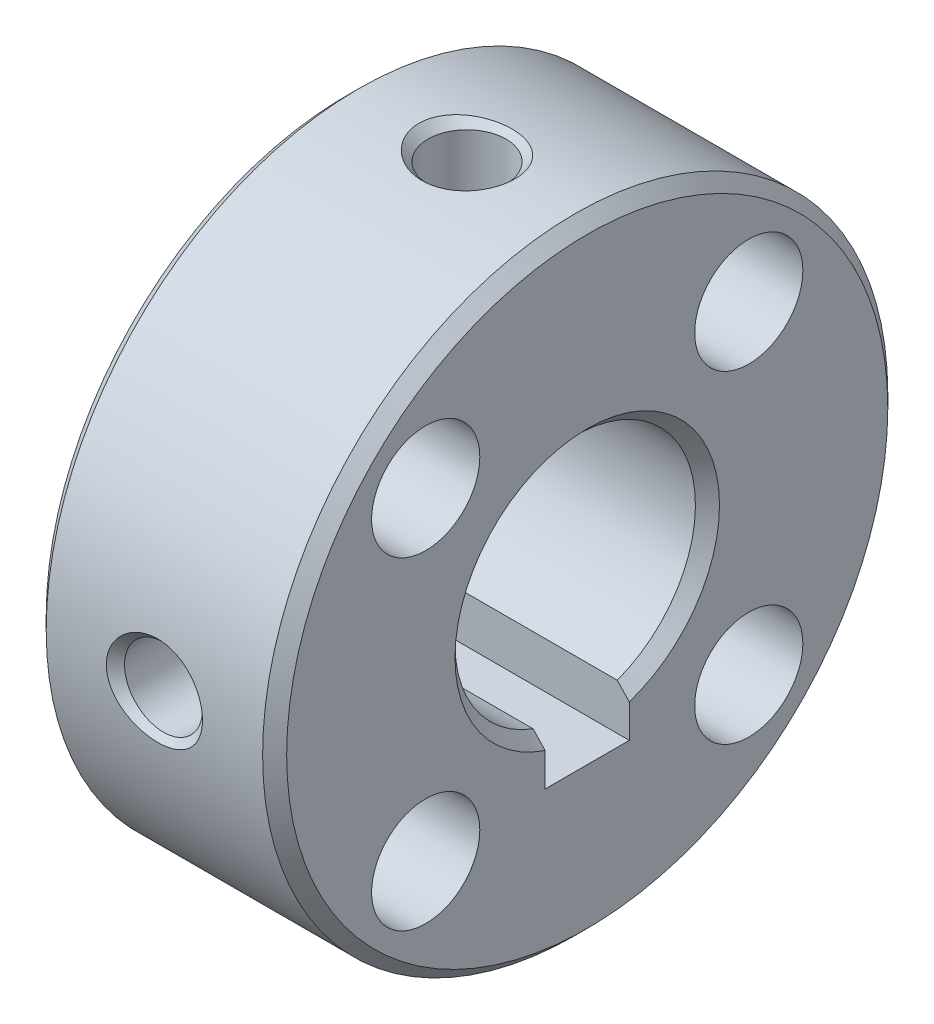
ISO-10303-21;
HEADER;
FILE_DESCRIPTION(('STEP AP214'),'2;1');
FILE_NAME('part.step','',(''),(''),'','','');
FILE_SCHEMA(('AUTOMOTIVE_DESIGN { 1 0 10303 214 1 1 1 1 }'));
ENDSEC;
DATA;
#1=APPLICATION_CONTEXT('core data for automotive mechanical design processes');
#2=APPLICATION_PROTOCOL_DEFINITION('international standard','automotive_design',2000,#1);
#3=PRODUCT_CONTEXT('',#1,'mechanical');
#4=PRODUCT('Part','Part','',(#3));
#5=PRODUCT_RELATED_PRODUCT_CATEGORY('part','',(#4));
#6=PRODUCT_DEFINITION_FORMATION('','',#4);
#7=PRODUCT_DEFINITION_CONTEXT('part definition',#1,'design');
#8=PRODUCT_DEFINITION('design','',#6,#7);
#9=PRODUCT_DEFINITION_SHAPE('','',#8);
#10=(LENGTH_UNIT() NAMED_UNIT(*) SI_UNIT(.MILLI.,.METRE.));
#11=(NAMED_UNIT(*) PLANE_ANGLE_UNIT() SI_UNIT($,.RADIAN.));
#12=(NAMED_UNIT(*) SI_UNIT($,.STERADIAN.) SOLID_ANGLE_UNIT());
#13=UNCERTAINTY_MEASURE_WITH_UNIT(LENGTH_MEASURE(1.E-05),#10,'distance_accuracy_value','');
#14=(GEOMETRIC_REPRESENTATION_CONTEXT(3) GLOBAL_UNCERTAINTY_ASSIGNED_CONTEXT((#13)) GLOBAL_UNIT_ASSIGNED_CONTEXT((#10,
#11,#12)) REPRESENTATION_CONTEXT('',''));
#15=CARTESIAN_POINT('',(0.,0.,0.));
#16=DIRECTION('',(0.,0.,1.));
#17=DIRECTION('',(1.,0.,0.));
#18=AXIS2_PLACEMENT_3D('',#15,#16,#17);
#19=CARTESIAN_POINT('',(10.,-6.7175144212722,-6.7175144212722));
#20=DIRECTION('',(-1.,0.,0.));
#21=DIRECTION('',(0.,0.,1.));
#22=AXIS2_PLACEMENT_3D('',#19,#20,#21);
#23=CYLINDRICAL_SURFACE('',#22,2.25);
#24=CARTESIAN_POINT('',(0.,-6.7175144212722,-6.7175144212722));
#25=DIRECTION('',(1.,0.,0.));
#26=DIRECTION('',(0.,0.,-1.));
#27=AXIS2_PLACEMENT_3D('',#24,#25,#26);
#28=CIRCLE('',#27,2.25);
#29=CARTESIAN_POINT('',(0.,-6.7175144212722,-8.9675144212722));
#30=VERTEX_POINT('',#29);
#31=EDGE_CURVE('E132',#30,#30,#28,.T.);
#32=ORIENTED_EDGE('',*,*,#31,.F.);
#33=EDGE_LOOP('',(#32));
#34=FACE_BOUND('',#33,.T.);
#35=CARTESIAN_POINT('',(10.,-6.7175144212722,-6.7175144212722));
#36=DIRECTION('',(1.,0.,0.));
#37=DIRECTION('',(0.,0.,-1.));
#38=AXIS2_PLACEMENT_3D('',#35,#36,#37);
#39=CIRCLE('',#38,2.25);
#40=CARTESIAN_POINT('',(10.,-6.7175144212722,-8.9675144212722));
#41=VERTEX_POINT('',#40);
#42=EDGE_CURVE('E123',#41,#41,#39,.T.);
#43=ORIENTED_EDGE('',*,*,#42,.T.);
#44=EDGE_LOOP('',(#43));
#45=FACE_BOUND('',#44,.T.);
#46=ADVANCED_FACE('F16',(#34,#45),#23,.F.);
#47=CARTESIAN_POINT('',(10.,-6.7175144212722,6.7175144212722));
#48=DIRECTION('',(-1.,0.,0.));
#49=DIRECTION('',(0.,0.,1.));
#50=AXIS2_PLACEMENT_3D('',#47,#48,#49);
#51=CYLINDRICAL_SURFACE('',#50,2.25);
#52=CARTESIAN_POINT('',(0.,-6.7175144212722,6.7175144212722));
#53=DIRECTION('',(1.,0.,0.));
#54=DIRECTION('',(0.,0.,-1.));
#55=AXIS2_PLACEMENT_3D('',#52,#53,#54);
#56=CIRCLE('',#55,2.25);
#57=CARTESIAN_POINT('',(0.,-6.7175144212722,4.4675144212722));
#58=VERTEX_POINT('',#57);
#59=EDGE_CURVE('E135',#58,#58,#56,.T.);
#60=ORIENTED_EDGE('',*,*,#59,.F.);
#61=EDGE_LOOP('',(#60));
#62=FACE_BOUND('',#61,.T.);
#63=CARTESIAN_POINT('',(10.,-6.7175144212722,6.7175144212722));
#64=DIRECTION('',(1.,0.,0.));
#65=DIRECTION('',(0.,0.,-1.));
#66=AXIS2_PLACEMENT_3D('',#63,#64,#65);
#67=CIRCLE('',#66,2.25);
#68=CARTESIAN_POINT('',(10.,-6.7175144212722,4.4675144212722));
#69=VERTEX_POINT('',#68);
#70=EDGE_CURVE('E177',#69,#69,#67,.T.);
#71=ORIENTED_EDGE('',*,*,#70,.T.);
#72=EDGE_LOOP('',(#71));
#73=FACE_BOUND('',#72,.T.);
#74=ADVANCED_FACE('F260',(#62,#73),#51,.F.);
#75=CARTESIAN_POINT('',(10.,6.7175144212722,6.7175144212722));
#76=DIRECTION('',(-1.,0.,0.));
#77=DIRECTION('',(0.,0.,1.));
#78=AXIS2_PLACEMENT_3D('',#75,#76,#77);
#79=CYLINDRICAL_SURFACE('',#78,2.25);
#80=CARTESIAN_POINT('',(0.,6.7175144212722,6.7175144212722));
#81=DIRECTION('',(1.,0.,0.));
#82=DIRECTION('',(0.,0.,-1.));
#83=AXIS2_PLACEMENT_3D('',#80,#81,#82);
#84=CIRCLE('',#83,2.25);
#85=CARTESIAN_POINT('',(0.,6.7175144212722,4.4675144212722));
#86=VERTEX_POINT('',#85);
#87=EDGE_CURVE('E157',#86,#86,#84,.T.);
#88=ORIENTED_EDGE('',*,*,#87,.F.);
#89=EDGE_LOOP('',(#88));
#90=FACE_BOUND('',#89,.T.);
#91=CARTESIAN_POINT('',(10.,6.7175144212722,6.7175144212722));
#92=DIRECTION('',(1.,0.,0.));
#93=DIRECTION('',(0.,0.,-1.));
#94=AXIS2_PLACEMENT_3D('',#91,#92,#93);
#95=CIRCLE('',#94,2.25);
#96=CARTESIAN_POINT('',(10.,6.7175144212722,4.4675144212722));
#97=VERTEX_POINT('',#96);
#98=EDGE_CURVE('E181',#97,#97,#95,.T.);
#99=ORIENTED_EDGE('',*,*,#98,.T.);
#100=EDGE_LOOP('',(#99));
#101=FACE_BOUND('',#100,.T.);
#102=ADVANCED_FACE('F256',(#90,#101),#79,.F.);
#103=CARTESIAN_POINT('',(10.,6.7175144212722,-6.7175144212722));
#104=DIRECTION('',(-1.,0.,0.));
#105=DIRECTION('',(0.,0.,1.));
#106=AXIS2_PLACEMENT_3D('',#103,#104,#105);
#107=CYLINDRICAL_SURFACE('',#106,2.25);
#108=CARTESIAN_POINT('',(0.,6.7175144212722,-6.7175144212722));
#109=DIRECTION('',(1.,0.,0.));
#110=DIRECTION('',(0.,0.,-1.));
#111=AXIS2_PLACEMENT_3D('',#108,#109,#110);
#112=CIRCLE('',#111,2.25);
#113=CARTESIAN_POINT('',(0.,6.7175144212722,-8.9675144212722));
#114=VERTEX_POINT('',#113);
#115=EDGE_CURVE('E161',#114,#114,#112,.T.);
#116=ORIENTED_EDGE('',*,*,#115,.F.);
#117=EDGE_LOOP('',(#116));
#118=FACE_BOUND('',#117,.T.);
#119=CARTESIAN_POINT('',(10.,6.7175144212722,-6.7175144212722));
#120=DIRECTION('',(1.,0.,0.));
#121=DIRECTION('',(0.,0.,-1.));
#122=AXIS2_PLACEMENT_3D('',#119,#120,#121);
#123=CIRCLE('',#122,2.25);
#124=CARTESIAN_POINT('',(10.,6.7175144212722,-8.9675144212722));
#125=VERTEX_POINT('',#124);
#126=EDGE_CURVE('E185',#125,#125,#123,.T.);
#127=ORIENTED_EDGE('',*,*,#126,.T.);
#128=EDGE_LOOP('',(#127));
#129=FACE_BOUND('',#128,.T.);
#130=ADVANCED_FACE('F259',(#118,#129),#107,.F.);
#131=CARTESIAN_POINT('',(10.,-6.6,-1.75));
#132=DIRECTION('',(0.,0.,1.));
#133=DIRECTION('',(0.,-1.,0.));
#134=AXIS2_PLACEMENT_3D('',#131,#132,#133);
#135=PLANE('',#134);
#136=DIRECTION('',(0.,1.,0.));
#137=VECTOR('',#136,1.);
#138=CARTESIAN_POINT('',(0.,-6.6,-1.75));
#139=LINE('',#138,#137);
#140=CARTESIAN_POINT('',(0.,-6.6,-1.75));
#141=VERTEX_POINT('',#140);
#142=CARTESIAN_POINT('',(0.,-5.21416340365355,-1.75));
#143=VERTEX_POINT('',#142);
#144=EDGE_CURVE('E138',#141,#143,#139,.T.);
#145=ORIENTED_EDGE('',*,*,#144,.F.);
#146=DIRECTION('',(-1.,0.,0.));
#147=VECTOR('',#146,1.);
#148=CARTESIAN_POINT('',(10.,-6.6,-1.75));
#149=LINE('',#148,#147);
#150=CARTESIAN_POINT('',(10.,-6.6,-1.75));
#151=VERTEX_POINT('',#150);
#152=EDGE_CURVE('E10',#151,#141,#149,.T.);
#153=ORIENTED_EDGE('',*,*,#152,.F.);
#154=DIRECTION('',(0.,1.,0.));
#155=VECTOR('',#154,1.);
#156=CARTESIAN_POINT('',(10.,-6.6,-1.75));
#157=LINE('',#156,#155);
#158=CARTESIAN_POINT('',(10.,-5.21416340365355,-1.75));
#159=VERTEX_POINT('',#158);
#160=EDGE_CURVE('E130',#151,#159,#157,.T.);
#161=ORIENTED_EDGE('',*,*,#160,.T.);
#162=CARTESIAN_POINT('',(9.5,-4.6837484987988,-1.75));
#163=CARTESIAN_POINT('',(9.6660933263045,-4.86105661680204,-1.75));
#164=CARTESIAN_POINT('',(9.83281493123391,-5.03781337258833,-1.75));
#165=CARTESIAN_POINT('',(10.,-5.21416340365356,-1.75));
#166=B_SPLINE_CURVE_WITH_KNOTS('',3,(#162,#163,#164,#165),.UNSPECIFIED.,.F.,.F.,(4,4),
(0.00580846189595319,0.00653929703107849),.UNSPECIFIED.);
#167=CARTESIAN_POINT('',(9.5,-4.6837484987988,-1.75));
#168=VERTEX_POINT('',#167);
#169=EDGE_CURVE('E112',#168,#159,#166,.T.);
#170=ORIENTED_EDGE('',*,*,#169,.F.);
#171=DIRECTION('',(1.,0.,0.));
#172=VECTOR('',#171,1.);
#173=CARTESIAN_POINT('',(10.,-4.6837484987988,-1.75));
#174=LINE('',#173,#172);
#175=CARTESIAN_POINT('',(0.5,-4.6837484987988,-1.75));
#176=VERTEX_POINT('',#175);
#177=EDGE_CURVE('E104',#176,#168,#174,.T.);
#178=ORIENTED_EDGE('',*,*,#177,.F.);
#179=CARTESIAN_POINT('',(0.,-5.21416340365355,-1.75));
#180=CARTESIAN_POINT('',(0.167175380453636,-5.03782359200693,-1.75));
#181=CARTESIAN_POINT('',(0.333896027324393,-4.86106798202704,-1.75));
#182=CARTESIAN_POINT('',(0.5,-4.6837484987988,-1.75));
#183=B_SPLINE_CURVE_WITH_KNOTS('',3,(#179,#180,#181,#182),.UNSPECIFIED.,.F.,.F.,(4,4),
(1.01727636145913E-06,0.0007298639149139),.UNSPECIFIED.);
#184=EDGE_CURVE('E19',#143,#176,#183,.T.);
#185=ORIENTED_EDGE('',*,*,#184,.F.);
#186=EDGE_LOOP('',(#145,#153,#161,#170,#178,#185));
#187=FACE_BOUND('',#186,.T.);
#188=ADVANCED_FACE('F110',(#187),#135,.T.);
#189=CARTESIAN_POINT('',(10.,-6.6,1.75));
#190=DIRECTION('',(0.,1.,0.));
#191=DIRECTION('',(1.,0.,0.));
#192=AXIS2_PLACEMENT_3D('',#189,#190,#191);
#193=PLANE('',#192);
#194=DIRECTION('',(0.,0.,-1.));
#195=VECTOR('',#194,1.);
#196=CARTESIAN_POINT('',(0.,-6.6,1.75));
#197=LINE('',#196,#195);
#198=CARTESIAN_POINT('',(0.,-6.6,1.75));
#199=VERTEX_POINT('',#198);
#200=EDGE_CURVE('E136',#199,#141,#197,.T.);
#201=ORIENTED_EDGE('',*,*,#200,.F.);
#202=DIRECTION('',(-1.,0.,0.));
#203=VECTOR('',#202,1.);
#204=CARTESIAN_POINT('',(10.,-6.6,1.75));
#205=LINE('',#204,#203);
#206=CARTESIAN_POINT('',(10.,-6.6,1.75));
#207=VERTEX_POINT('',#206);
#208=EDGE_CURVE('E27',#207,#199,#205,.T.);
#209=ORIENTED_EDGE('',*,*,#208,.F.);
#210=DIRECTION('',(0.,0.,-1.));
#211=VECTOR('',#210,1.);
#212=CARTESIAN_POINT('',(10.,-6.6,1.75));
#213=LINE('',#212,#211);
#214=EDGE_CURVE('E131',#207,#151,#213,.T.);
#215=ORIENTED_EDGE('',*,*,#214,.T.);
#216=ORIENTED_EDGE('',*,*,#152,.T.);
#217=EDGE_LOOP('',(#201,#209,#215,#216));
#218=FACE_BOUND('',#217,.T.);
#219=ADVANCED_FACE('F270',(#218),#193,.T.);
#220=CARTESIAN_POINT('',(10.,0.,1.75));
#221=DIRECTION('',(0.,0.,-1.));
#222=DIRECTION('',(0.,-1.,0.));
#223=AXIS2_PLACEMENT_3D('',#220,#221,#222);
#224=PLANE('',#223);
#225=DIRECTION('',(-1.,0.,0.));
#226=VECTOR('',#225,1.);
#227=CARTESIAN_POINT('',(10.,-4.6837484987988,1.75));
#228=LINE('',#227,#226);
#229=CARTESIAN_POINT('',(9.5,-4.6837484987988,1.75));
#230=VERTEX_POINT('',#229);
#231=CARTESIAN_POINT('',(0.5,-4.6837484987988,1.75));
#232=VERTEX_POINT('',#231);
#233=EDGE_CURVE('E106',#230,#232,#228,.T.);
#234=ORIENTED_EDGE('',*,*,#233,.F.);
#235=CARTESIAN_POINT('',(10.,-5.21416340365355,1.75));
#236=CARTESIAN_POINT('',(9.83282461954636,-5.03782359200693,1.75));
#237=CARTESIAN_POINT('',(9.66610397267561,-4.86106798202704,1.75));
#238=CARTESIAN_POINT('',(9.5,-4.6837484987988,1.75));
#239=B_SPLINE_CURVE_WITH_KNOTS('',3,(#235,#236,#237,#238),.UNSPECIFIED.,.F.,.F.,(4,4),
(1.01727636146181E-06,0.000729863914913902),.UNSPECIFIED.);
#240=CARTESIAN_POINT('',(10.,-5.21416340365355,1.75));
#241=VERTEX_POINT('',#240);
#242=EDGE_CURVE('E172',#241,#230,#239,.T.);
#243=ORIENTED_EDGE('',*,*,#242,.F.);
#244=DIRECTION('',(0.,-1.,0.));
#245=VECTOR('',#244,1.);
#246=CARTESIAN_POINT('',(10.,0.,1.75));
#247=LINE('',#246,#245);
#248=EDGE_CURVE('E127',#241,#207,#247,.T.);
#249=ORIENTED_EDGE('',*,*,#248,.T.);
#250=ORIENTED_EDGE('',*,*,#208,.T.);
#251=DIRECTION('',(0.,-1.,0.));
#252=VECTOR('',#251,1.);
#253=CARTESIAN_POINT('',(0.,0.,1.75));
#254=LINE('',#253,#252);
#255=CARTESIAN_POINT('',(0.,-5.21416340365355,1.75));
#256=VERTEX_POINT('',#255);
#257=EDGE_CURVE('E144',#256,#199,#254,.T.);
#258=ORIENTED_EDGE('',*,*,#257,.F.);
#259=CARTESIAN_POINT('',(0.5,-4.6837484987988,1.75));
#260=CARTESIAN_POINT('',(0.333906673695495,-4.86105661680204,1.75));
#261=CARTESIAN_POINT('',(0.167185068766092,-5.03781337258833,1.75));
#262=CARTESIAN_POINT('',(0.,-5.21416340365356,1.75));
#263=B_SPLINE_CURVE_WITH_KNOTS('',3,(#259,#260,#261,#262),.UNSPECIFIED.,.F.,.F.,(4,4),
(0.00580846189595319,0.00653929703107849),.UNSPECIFIED.);
#264=EDGE_CURVE('E98',#232,#256,#263,.T.);
#265=ORIENTED_EDGE('',*,*,#264,.F.);
#266=EDGE_LOOP('',(#234,#243,#249,#250,#258,#265));
#267=FACE_BOUND('',#266,.T.);
#268=ADVANCED_FACE('F490',(#267),#224,.T.);
#269=CARTESIAN_POINT('',(5.,0.,2.5));
#270=DIRECTION('',(0.,0.,-1.));
#271=DIRECTION('',(0.,1.,0.));
#272=AXIS2_PLACEMENT_3D('',#269,#270,#271);
#273=CYLINDRICAL_SURFACE('',#272,1.621);
#274=CARTESIAN_POINT('',(5.,0.,12.621));
#275=DIRECTION('',(0.,0.,-1.));
#276=DIRECTION('',(0.,1.,0.));
#277=AXIS2_PLACEMENT_3D('',#274,#275,#276);
#278=CIRCLE('',#277,1.621);
#279=CARTESIAN_POINT('',(5.,1.621,12.621));
#280=VERTEX_POINT('',#279);
#281=EDGE_CURVE('E147',#280,#280,#278,.T.);
#282=ORIENTED_EDGE('',*,*,#281,.F.);
#283=EDGE_LOOP('',(#282));
#284=FACE_BOUND('',#283,.T.);
#285=CARTESIAN_POINT('',(5.,1.621,4.7299428114936));
#286=CARTESIAN_POINT('',(4.91155533903857,1.62099994328776,4.72994292406814));
#287=CARTESIAN_POINT('',(4.82310933967548,1.61373692937462,4.73245066423388));
#288=CARTESIAN_POINT('',(4.64882792226246,1.58496808142389,4.74216205880075));
#289=CARTESIAN_POINT('',(4.56299305821168,1.56345924662211,4.7493667025607));
#290=CARTESIAN_POINT('',(4.39648524387535,1.50702583103183,4.76757195551883));
#291=CARTESIAN_POINT('',(4.31580294721599,1.4721263954811,4.77856544600252));
#292=CARTESIAN_POINT('',(4.16141399635067,1.38998746751381,4.8030995572268));
#293=CARTESIAN_POINT('',(4.08770875224652,1.34274548782248,4.8166406912155));
#294=CARTESIAN_POINT('',(3.9466396110385,1.23539069267372,4.8453061470038));
#295=CARTESIAN_POINT('',(3.87957160452023,1.17489908548066,4.86046835330996));
#296=CARTESIAN_POINT('',(3.75633191937484,1.04357152557501,4.89034638937721));
#297=CARTESIAN_POINT('',(3.70016188610794,0.972734013678075,4.90506215145229));
#298=CARTESIAN_POINT('',(3.59898652032845,0.820578393714075,4.93282551035559));
#299=CARTESIAN_POINT('',(3.55428885000518,0.739045824357353,4.94582333344247));
#300=CARTESIAN_POINT('',(3.47935822189785,0.569126300769084,4.96824171071121));
#301=CARTESIAN_POINT('',(3.44912158919692,0.480741094608509,4.97766317361134));
#302=CARTESIAN_POINT('',(3.40496784875951,0.302725713616444,4.99159902928383));
#303=CARTESIAN_POINT('',(3.39054437205525,0.213233246305292,4.99626532047137));
#304=CARTESIAN_POINT('',(3.37681883640726,0.0329849011828254,5.00070305137215));
#305=CARTESIAN_POINT('',(3.37751308553128,-0.0577706627545897,5.00047568617588));
#306=CARTESIAN_POINT('',(3.39367679157553,-0.234393884666983,4.9952559207467));
#307=CARTESIAN_POINT('',(3.40859673428687,-0.320317917411438,4.99044074476224));
#308=CARTESIAN_POINT('',(3.45188273226516,-0.488369179265733,4.97680687838058));
#309=CARTESIAN_POINT('',(3.48024968497549,-0.570496154561233,4.96798792077566));
#310=CARTESIAN_POINT('',(3.5499595290533,-0.729853012220349,4.94710629162889));
#311=CARTESIAN_POINT('',(3.5914633894381,-0.807007027582676,4.93500366256205));
#312=CARTESIAN_POINT('',(3.68613786401976,-0.953421632492302,4.90882135304546));
#313=CARTESIAN_POINT('',(3.73931159544957,-1.02268010547286,4.89474114471111));
#314=CARTESIAN_POINT('',(3.85860898566963,-1.15461028599396,4.86535187074547));
#315=CARTESIAN_POINT('',(3.92520511550441,-1.21684940617501,4.85001600819242));
#316=CARTESIAN_POINT('',(4.06802613798782,-1.32941122429761,4.8203798887855));
#317=CARTESIAN_POINT('',(4.14425235022557,-1.37973228641201,4.80607977428124));
#318=CARTESIAN_POINT('',(4.30547399049183,-1.46758519790192,4.77999260788244));
#319=CARTESIAN_POINT('',(4.39056945026866,-1.50494453323711,4.76824018219582));
#320=CARTESIAN_POINT('',(4.56631866058027,-1.56466156409866,4.74898201916711));
#321=CARTESIAN_POINT('',(4.65697021619478,-1.58702514249676,4.74147461667353));
#322=CARTESIAN_POINT('',(4.83708817443766,-1.61525576019124,4.73193012064711));
#323=CARTESIAN_POINT('',(4.92643835540342,-1.621789848282,4.7296720002319));
#324=CARTESIAN_POINT('',(5.10496876986582,-1.62005801882603,4.73026575887034));
#325=CARTESIAN_POINT('',(5.19414902957036,-1.6117946063918,4.73311677298359));
#326=CARTESIAN_POINT('',(5.36684695694947,-1.58130032679845,4.74338815178071));
#327=CARTESIAN_POINT('',(5.450454511033,-1.55952317660208,4.75065993614618));
#328=CARTESIAN_POINT('',(5.61281554339188,-1.50315878411261,4.76879273797322));
#329=CARTESIAN_POINT('',(5.69156818840378,-1.46856934990712,4.77965436954789));
#330=CARTESIAN_POINT('',(5.84463470079953,-1.38636523898081,4.80415227041365));
#331=CARTESIAN_POINT('',(5.91874092518124,-1.3383866508917,4.81786283341636));
#332=CARTESIAN_POINT('',(6.05809248396621,-1.23118406709359,4.84636534697361));
#333=CARTESIAN_POINT('',(6.12333533464114,-1.17195693037732,4.86115759886416));
#334=CARTESIAN_POINT('',(6.24614749724094,-1.04076324157511,4.89096409180583));
#335=CARTESIAN_POINT('',(6.30323787873655,-0.968342529044843,4.9059582447373));
#336=CARTESIAN_POINT('',(6.40448116455052,-0.81458247858654,4.93381707884543));
#337=CARTESIAN_POINT('',(6.44863459502615,-0.733243503557102,4.94668184661682));
#338=CARTESIAN_POINT('',(6.52233569157413,-0.564408229427763,4.9687657202333));
#339=CARTESIAN_POINT('',(6.55198393709852,-0.476959279511785,4.97800983986412));
#340=CARTESIAN_POINT('',(6.59604138153434,-0.297960456827444,4.99191991979584));
#341=CARTESIAN_POINT('',(6.61045575236433,-0.20641198686089,4.99658743382089));
#342=CARTESIAN_POINT('',(6.62319075782049,-0.0262056487412074,5.00070747180682));
#343=CARTESIAN_POINT('',(6.62220075299711,0.0623989457475938,5.00038338168654));
#344=CARTESIAN_POINT('',(6.60584070800612,0.238121147142904,4.99509998201874));
#345=CARTESIAN_POINT('',(6.59047172996136,0.325238863395776,4.9901410148329));
#346=CARTESIAN_POINT('',(6.54623958064776,0.49427784854005,4.9762220938268));
#347=CARTESIAN_POINT('',(6.5175730064589,0.576255706416393,4.96732051306458));
#348=CARTESIAN_POINT('',(6.44773928208445,0.734273588452601,4.94643321450304));
#349=CARTESIAN_POINT('',(6.40656991682217,0.810312557436362,4.93444695025838));
#350=CARTESIAN_POINT('',(6.31120604490491,0.957247131683683,4.90810047886069));
#351=CARTESIAN_POINT('',(6.25659950279803,1.02786272358386,4.89367087241373));
#352=CARTESIAN_POINT('',(6.13662361656603,1.15915513259591,4.86424657457313));
#353=CARTESIAN_POINT('',(6.07125093350982,1.2198288547276,4.84925170899019));
#354=CARTESIAN_POINT('',(5.92874710351001,1.33175539611673,4.81974113178927));
#355=CARTESIAN_POINT('',(5.85127430182114,1.38258438432228,4.80526278800298));
#356=CARTESIAN_POINT('',(5.68844156307284,1.470455934267,4.77910787173754));
#357=CARTESIAN_POINT('',(5.60308421473206,1.50750300105648,4.76743038415551));
#358=CARTESIAN_POINT('',(5.43242064814403,1.56468319448465,4.74895943654945));
#359=CARTESIAN_POINT('',(5.34745101628338,1.58573603014659,4.74190430453168));
#360=CARTESIAN_POINT('',(5.17498751947909,1.61389238253452,4.73239662209205));
#361=CARTESIAN_POINT('',(5.08749441463789,1.62100005610292,4.72994270012856));
#362=CARTESIAN_POINT('',(5.,1.621,4.7299428114936));
#363=B_SPLINE_CURVE_WITH_KNOTS('',3,(#285,#286,#287,#288,#289,#290,#291,#292,#293,#294,#295,
#296,#297,#298,#299,#300,#301,#302,#303,#304,#305,#306,#307,#308,#309,#310,#311,#312,#313,#314,
#315,#316,#317,#318,#319,#320,#321,#322,#323,#324,#325,#326,#327,#328,#329,#330,#331,#332,#333,
#334,#335,#336,#337,#338,#339,#340,#341,#342,#343,#344,#345,#346,#347,#348,#349,#350,#351,#352,
#353,#354,#355,#356,#357,#358,#359,#360,#361,#362),.UNSPECIFIED.,.T.,.F.,(4,2,2,2,2,2,2,2,2,2,2,
2,2,2,2,2,2,2,2,2,2,2,2,2,2,2,2,2,2,2,2,2,2,2,2,2,2,2,4),(0.,0.265010337952567,
0.530076515899162,0.794647362252694,1.0592715662163,1.3327780284543,1.60632575222377,
1.88658347189974,2.16676993307947,2.43769552312799,2.70855495059927,2.96935821470254,
3.23017888707159,3.49432794371181,3.75854764539319,4.03457330013642,4.31063681917955,
4.59024507882617,4.86974358320068,5.13724191082014,5.40469495714003,5.66362093392657,
5.92259122797803,6.18943208905179,6.45634757172375,6.73530388011558,7.0142488415316,
7.29123116370581,7.56811941981514,7.83265373999367,8.0971685215193,8.3578914909671,
8.61866067878424,8.88872660433205,9.15887644439551,9.43886988728821,9.71877172501308,
9.98101298327066,10.2431760594823),.UNSPECIFIED.);
#364=CARTESIAN_POINT('',(5.,1.621,4.7299428114936));
#365=VERTEX_POINT('',#364);
#366=EDGE_CURVE('E141',#365,#365,#363,.T.);
#367=ORIENTED_EDGE('',*,*,#366,.F.);
#368=EDGE_LOOP('',(#367));
#369=FACE_BOUND('',#368,.T.);
#370=ADVANCED_FACE('F232',(#284,#369),#273,.F.);
#371=CARTESIAN_POINT('',(5.,0.,13.));
#372=DIRECTION('',(0.,0.,1.));
#373=DIRECTION('',(0.,-1.,0.));
#374=AXIS2_PLACEMENT_3D('',#371,#372,#373);
#375=CONICAL_SURFACE('',#374,2.,0.785398163397447);
#376=CARTESIAN_POINT('',(4.37197990100598,-1.77076575658757,12.8788349158576));
#377=CARTESIAN_POINT('',(4.48481207390751,-1.80568329165386,12.8740353717118));
#378=CARTESIAN_POINT('',(4.6007261239575,-1.83110741236611,12.8704039812746));
#379=CARTESIAN_POINT('',(4.83532212514417,-1.86240293329067,12.865912410465));
#380=CARTESIAN_POINT('',(4.95400765542596,-1.86824746107804,12.8650560387783));
#381=CARTESIAN_POINT('',(5.19075180268702,-1.86021891280464,12.8662194542773));
#382=CARTESIAN_POINT('',(5.30881018633592,-1.84633895232079,12.8682402456775));
#383=CARTESIAN_POINT('',(5.5408659626492,-1.79911712822329,12.8749268082779));
#384=CARTESIAN_POINT('',(5.65486440209349,-1.76578032030289,12.8795918923723));
#385=CARTESIAN_POINT('',(5.8753114085957,-1.68037848963056,12.8910113114541));
#386=CARTESIAN_POINT('',(5.98177191246771,-1.62834390771241,12.8977622480884));
#387=CARTESIAN_POINT('',(6.1840015594711,-1.50660248261966,12.9125479232479));
#388=CARTESIAN_POINT('',(6.27977103044748,-1.43689618157027,12.9205826223875));
#389=CARTESIAN_POINT('',(6.45430292142973,-1.28397756103486,12.9366572485622));
#390=CARTESIAN_POINT('',(6.53352261848613,-1.20128742210393,12.9446882363723));
#391=CARTESIAN_POINT('',(6.67576765526801,-1.02291059417123,12.9600013626041));
#392=CARTESIAN_POINT('',(6.73880044347925,-0.927229913927718,12.9672838445258));
#393=CARTESIAN_POINT('',(6.84235381401129,-0.732309702032555,12.9797000564412));
#394=CARTESIAN_POINT('',(6.88408467651908,-0.633720751487718,12.9849438016903));
#395=CARTESIAN_POINT('',(6.94911840555695,-0.430560779207337,12.9932644671781));
#396=CARTESIAN_POINT('',(6.97243093321479,-0.32599292454817,12.9963425233114));
#397=CARTESIAN_POINT('',(6.998573530062,-0.121635039454945,12.9998048984121));
#398=CARTESIAN_POINT('',(7.00270520028233,-0.0220127968565839,13.0003603389341));
#399=CARTESIAN_POINT('',(6.99385361688418,0.176443237078858,12.9991810270476));
#400=CARTESIAN_POINT('',(6.98087340766289,0.275277165518983,12.9974466820179));
#401=CARTESIAN_POINT('',(6.93891462518156,0.466779725600597,12.9919618694001));
#402=CARTESIAN_POINT('',(6.9103488062727,0.559541054742703,12.9882634803418));
#403=CARTESIAN_POINT('',(6.83862898213121,0.739143878294936,12.9792819841268));
#404=CARTESIAN_POINT('',(6.79547330916774,0.825984694581329,12.973998695812));
#405=CARTESIAN_POINT('',(6.69443415621612,0.994492121928886,12.9621897752885));
#406=CARTESIAN_POINT('',(6.63610834100422,1.07589036226423,12.955628650084));
#407=CARTESIAN_POINT('',(6.50742140445212,1.22848274635711,12.9420520295784));
#408=CARTESIAN_POINT('',(6.43705693428333,1.2996740406626,12.935036408187));
#409=CARTESIAN_POINT('',(6.2812356708834,1.43492991450489,12.9207552447647));
#410=CARTESIAN_POINT('',(6.195082178731,1.49819335061495,12.9135046202024));
#411=CARTESIAN_POINT('',(6.01384458008824,1.61040732736672,12.8999918851617));
#412=CARTESIAN_POINT('',(5.91875781895066,1.65935359557186,12.8937300700132));
#413=CARTESIAN_POINT('',(5.71582608824071,1.74473559060586,12.8824640909163));
#414=CARTESIAN_POINT('',(5.60755413854223,1.78017235025571,12.8775658247183));
#415=CARTESIAN_POINT('',(5.3866507125417,1.83323349584435,12.8701194731766));
#416=CARTESIAN_POINT('',(5.27401834558738,1.85085422256266,12.8675718706431));
#417=CARTESIAN_POINT('',(5.04319734380034,1.86827162002087,12.8650553487674));
#418=CARTESIAN_POINT('',(4.92495613327709,1.86739299627475,12.8651841249712));
#419=CARTESIAN_POINT('',(4.69026140054708,1.84615780558204,12.8682482238801));
#420=CARTESIAN_POINT('',(4.57380807397929,1.82579912225101,12.8711838515318));
#421=CARTESIAN_POINT('',(4.34517172699066,1.76577982197805,12.879555179963));
#422=CARTESIAN_POINT('',(4.23302517090001,1.7259823066455,12.8850085971834));
#423=CARTESIAN_POINT('',(4.0172624860627,1.62781743830048,12.897776886102));
#424=CARTESIAN_POINT('',(3.91364627410915,1.56945026644765,12.9050917396404));
#425=CARTESIAN_POINT('',(3.72047408789515,1.4368608647697,12.9205175686662));
#426=CARTESIAN_POINT('',(3.63066101071447,1.36301169035943,12.9286077319729));
#427=CARTESIAN_POINT('',(3.46565762015167,1.20043353687346,12.9447134423455));
#428=CARTESIAN_POINT('',(3.3904624488959,1.11170951937545,12.952729013354));
#429=CARTESIAN_POINT('',(3.26153564583447,0.927123413796772,12.9672090745376));
#430=CARTESIAN_POINT('',(3.20683320789319,0.831945421389003,12.9737355213108));
#431=CARTESIAN_POINT('',(3.11557404079393,0.633155806307853,12.9849523969982));
#432=CARTESIAN_POINT('',(3.07900707129124,0.529548981607793,12.9896438617333));
#433=CARTESIAN_POINT('',(3.02772832467603,0.325065617267885,12.9963079888769));
#434=CARTESIAN_POINT('',(3.01160999316786,0.224546401169812,12.9984548607196));
#435=CARTESIAN_POINT('',(2.99718264083972,0.0222252973082407,13.0003740309347));
#436=CARTESIAN_POINT('',(2.99886826892509,-0.0795761958712015,13.0001470427862));
#437=CARTESIAN_POINT('',(3.0194938859252,-0.276853424007808,12.9974100730011));
#438=CARTESIAN_POINT('',(3.03767621638975,-0.372411122606524,12.9950003477473));
#439=CARTESIAN_POINT('',(3.08948188896283,-0.559157777650415,12.9883054347405));
#440=CARTESIAN_POINT('',(3.12310514810494,-0.650346757566467,12.9840202570646));
#441=CARTESIAN_POINT('',(3.20512413875468,-0.827371277800821,12.9739525346693));
#442=CARTESIAN_POINT('',(3.25373333750055,-0.91310632477676,12.9681485487673));
#443=CARTESIAN_POINT('',(3.36386164785923,-1.07578303933747,12.95566905416));
#444=CARTESIAN_POINT('',(3.42538661868772,-1.15272069144777,12.9489931504318));
#445=CARTESIAN_POINT('',(3.56351973565265,-1.30059842081819,12.9350027802277));
#446=CARTESIAN_POINT('',(3.64081528572716,-1.37089389626279,12.9276741177026));
#447=CARTESIAN_POINT('',(3.80544766794275,-1.49844975719107,12.9135113622502));
#448=CARTESIAN_POINT('',(3.89277734666432,-1.55571934322232,12.9066769225815));
#449=CARTESIAN_POINT('',(4.04555641518522,-1.63997155692815,12.8961878934785));
#450=CARTESIAN_POINT('',(4.1089253860257,-1.67075481164443,12.8922205607197));
#451=CARTESIAN_POINT('',(4.23849073910569,-1.72573969157397,12.884975273979));
#452=CARTESIAN_POINT('',(4.30468722610704,-1.74994107267815,12.8816973455668));
#453=CARTESIAN_POINT('',(4.37197990100598,-1.77076575658757,12.8788349158576));
#454=B_SPLINE_CURVE_WITH_KNOTS('',3,(#376,#377,#378,#379,#380,#381,#382,#383,#384,#385,#386,
#387,#388,#389,#390,#391,#392,#393,#394,#395,#396,#397,#398,#399,#400,#401,#402,#403,#404,#405,
#406,#407,#408,#409,#410,#411,#412,#413,#414,#415,#416,#417,#418,#419,#420,#421,#422,#423,#424,
#425,#426,#427,#428,#429,#430,#431,#432,#433,#434,#435,#436,#437,#438,#439,#440,#441,#442,#443,
#444,#445,#446,#447,#448,#449,#450,#451,#452,#453),.UNSPECIFIED.,.T.,.F.,(4,2,2,2,2,2,2,2,2,2,2,
2,2,2,2,2,2,2,2,2,2,2,2,2,2,2,2,2,2,2,2,2,2,2,2,2,2,2,4),(0.,0.354369417214423,
0.709224997384827,1.06420446295155,1.41909173121838,1.7734038251873,2.12770505104082,
2.47030314941195,2.8127433159489,3.13260545788216,3.45229970817264,3.74994797272599,
4.04754328942744,4.33761503313025,4.62771994544779,4.92747933474283,5.22732224498117,
5.54732788145753,5.86742891474952,6.20797904251194,6.54859910138755,6.90167391455879,
7.25478709141603,7.61042373382879,7.96605690687055,8.31394352513857,8.66171433412825,
8.98988545714185,9.31787106399518,9.62179466095417,9.92562691431983,10.2161742977537,
10.506720120051,10.8016124232353,11.0966387939708,11.4095169101013,11.722173340653,
11.9335100640993,12.1448546245515),.UNSPECIFIED.);
#455=CARTESIAN_POINT('',(4.37197990100598,-1.77076575658757,12.8788349158576));
#456=VERTEX_POINT('',#455);
#457=EDGE_CURVE('E206',#456,#456,#454,.F.);
#458=ORIENTED_EDGE('',*,*,#457,.F.);
#459=EDGE_LOOP('',(#458));
#460=FACE_BOUND('',#459,.T.);
#461=ORIENTED_EDGE('',*,*,#281,.T.);
#462=EDGE_LOOP('',(#461));
#463=FACE_BOUND('',#462,.T.);
#464=ADVANCED_FACE('F227',(#460,#463),#375,.F.);
#465=CARTESIAN_POINT('',(5.,2.5,0.));
#466=DIRECTION('',(0.,-1.,0.));
#467=DIRECTION('',(0.,0.,-1.));
#468=AXIS2_PLACEMENT_3D('',#465,#466,#467);
#469=CYLINDRICAL_SURFACE('',#468,1.621);
#470=CARTESIAN_POINT('',(5.,12.621,0.));
#471=DIRECTION('',(0.,-1.,0.));
#472=DIRECTION('',(0.,0.,-1.));
#473=AXIS2_PLACEMENT_3D('',#470,#471,#472);
#474=CIRCLE('',#473,1.621);
#475=CARTESIAN_POINT('',(5.,12.621,-1.621));
#476=VERTEX_POINT('',#475);
#477=EDGE_CURVE('E197',#476,#476,#474,.T.);
#478=ORIENTED_EDGE('',*,*,#477,.F.);
#479=EDGE_LOOP('',(#478));
#480=FACE_BOUND('',#479,.T.);
#481=CARTESIAN_POINT('',(5.,4.7299428114936,-1.621));
#482=CARTESIAN_POINT('',(4.91155533903857,4.72994292406814,-1.62099994328776));
#483=CARTESIAN_POINT('',(4.82310933967548,4.73245066423388,-1.61373692937462));
#484=CARTESIAN_POINT('',(4.64882792226246,4.74216205880075,-1.58496808142389));
#485=CARTESIAN_POINT('',(4.56299305821168,4.7493667025607,-1.56345924662211));
#486=CARTESIAN_POINT('',(4.39648524387535,4.76757195551883,-1.50702583103183));
#487=CARTESIAN_POINT('',(4.31580294721599,4.77856544600252,-1.4721263954811));
#488=CARTESIAN_POINT('',(4.16141399635067,4.80309955722681,-1.38998746751381));
#489=CARTESIAN_POINT('',(4.08770875224652,4.8166406912155,-1.34274548782248));
#490=CARTESIAN_POINT('',(3.9466396110385,4.8453061470038,-1.23539069267372));
#491=CARTESIAN_POINT('',(3.87957160452023,4.86046835330996,-1.17489908548066));
#492=CARTESIAN_POINT('',(3.75633191937484,4.89034638937721,-1.04357152557501));
#493=CARTESIAN_POINT('',(3.70016188610794,4.90506215145229,-0.972734013678075));
#494=CARTESIAN_POINT('',(3.59898652032845,4.93282551035559,-0.820578393714075));
#495=CARTESIAN_POINT('',(3.55428885000518,4.94582333344247,-0.739045824357354));
#496=CARTESIAN_POINT('',(3.47935822189785,4.96824171071121,-0.569126300769085));
#497=CARTESIAN_POINT('',(3.44912158919692,4.97766317361134,-0.48074109460851));
#498=CARTESIAN_POINT('',(3.40496784875951,4.99159902928383,-0.302725713616444));
#499=CARTESIAN_POINT('',(3.39054437205525,4.99626532047137,-0.213233246305292));
#500=CARTESIAN_POINT('',(3.37681883640726,5.00070305137215,-0.0329849011828255));
#501=CARTESIAN_POINT('',(3.37751308553128,5.00047568617588,0.0577706627545897));
#502=CARTESIAN_POINT('',(3.39367679157553,4.9952559207467,0.234393884666983));
#503=CARTESIAN_POINT('',(3.40859673428687,4.99044074476224,0.320317917411438));
#504=CARTESIAN_POINT('',(3.45188273226516,4.97680687838058,0.488369179265733));
#505=CARTESIAN_POINT('',(3.48024968497549,4.96798792077566,0.570496154561233));
#506=CARTESIAN_POINT('',(3.5499595290533,4.94710629162889,0.729853012220349));
#507=CARTESIAN_POINT('',(3.5914633894381,4.93500366256205,0.807007027582676));
#508=CARTESIAN_POINT('',(3.68613786401976,4.90882135304546,0.953421632492302));
#509=CARTESIAN_POINT('',(3.73931159544957,4.89474114471111,1.02268010547286));
#510=CARTESIAN_POINT('',(3.85860898566963,4.86535187074547,1.15461028599396));
#511=CARTESIAN_POINT('',(3.92520511550441,4.85001600819242,1.21684940617501));
#512=CARTESIAN_POINT('',(4.06802613798782,4.8203798887855,1.32941122429761));
#513=CARTESIAN_POINT('',(4.14425235022557,4.80607977428124,1.37973228641201));
#514=CARTESIAN_POINT('',(4.30547399049183,4.77999260788244,1.46758519790192));
#515=CARTESIAN_POINT('',(4.39056945026866,4.76824018219582,1.50494453323711));
#516=CARTESIAN_POINT('',(4.56631866058027,4.74898201916711,1.56466156409866));
#517=CARTESIAN_POINT('',(4.65697021619478,4.74147461667353,1.58702514249676));
#518=CARTESIAN_POINT('',(4.83708817443766,4.73193012064711,1.61525576019124));
#519=CARTESIAN_POINT('',(4.92643835540342,4.7296720002319,1.621789848282));
#520=CARTESIAN_POINT('',(5.10496876986582,4.73026575887034,1.62005801882603));
#521=CARTESIAN_POINT('',(5.19414902957036,4.73311677298359,1.6117946063918));
#522=CARTESIAN_POINT('',(5.36684695694947,4.74338815178071,1.58130032679845));
#523=CARTESIAN_POINT('',(5.450454511033,4.75065993614618,1.55952317660208));
#524=CARTESIAN_POINT('',(5.61281554339188,4.76879273797322,1.50315878411262));
#525=CARTESIAN_POINT('',(5.69156818840378,4.77965436954789,1.46856934990713));
#526=CARTESIAN_POINT('',(5.84463470079953,4.80415227041365,1.38636523898081));
#527=CARTESIAN_POINT('',(5.91874092518124,4.81786283341636,1.3383866508917));
#528=CARTESIAN_POINT('',(6.05809248396621,4.84636534697361,1.23118406709359));
#529=CARTESIAN_POINT('',(6.12333533464114,4.86115759886416,1.17195693037732));
#530=CARTESIAN_POINT('',(6.24614749724094,4.89096409180583,1.04076324157511));
#531=CARTESIAN_POINT('',(6.30323787873655,4.9059582447373,0.968342529044843));
#532=CARTESIAN_POINT('',(6.40448116455052,4.93381707884543,0.81458247858654));
#533=CARTESIAN_POINT('',(6.44863459502615,4.94668184661682,0.733243503557102));
#534=CARTESIAN_POINT('',(6.52233569157413,4.9687657202333,0.564408229427764));
#535=CARTESIAN_POINT('',(6.55198393709852,4.97800983986412,0.476959279511786));
#536=CARTESIAN_POINT('',(6.59604138153434,4.99191991979584,0.297960456827445));
#537=CARTESIAN_POINT('',(6.61045575236433,4.99658743382089,0.20641198686089));
#538=CARTESIAN_POINT('',(6.62319075782049,5.00070747180682,0.0262056487412077));
#539=CARTESIAN_POINT('',(6.62220075299711,5.00038338168654,-0.0623989457475935));
#540=CARTESIAN_POINT('',(6.60584070800612,4.99509998201874,-0.238121147142904));
#541=CARTESIAN_POINT('',(6.59047172996136,4.9901410148329,-0.325238863395776));
#542=CARTESIAN_POINT('',(6.54623958064776,4.9762220938268,-0.49427784854005));
#543=CARTESIAN_POINT('',(6.5175730064589,4.96732051306458,-0.576255706416393));
#544=CARTESIAN_POINT('',(6.44773928208445,4.94643321450304,-0.7342735884526));
#545=CARTESIAN_POINT('',(6.40656991682217,4.93444695025838,-0.810312557436362));
#546=CARTESIAN_POINT('',(6.31120604490491,4.90810047886069,-0.957247131683683));
#547=CARTESIAN_POINT('',(6.25659950279803,4.89367087241373,-1.02786272358386));
#548=CARTESIAN_POINT('',(6.13662361656603,4.86424657457313,-1.15915513259591));
#549=CARTESIAN_POINT('',(6.07125093350982,4.84925170899019,-1.2198288547276));
#550=CARTESIAN_POINT('',(5.92874710351001,4.81974113178927,-1.33175539611673));
#551=CARTESIAN_POINT('',(5.85127430182114,4.80526278800298,-1.38258438432228));
#552=CARTESIAN_POINT('',(5.68844156307284,4.77910787173754,-1.470455934267));
#553=CARTESIAN_POINT('',(5.60308421473205,4.76743038415551,-1.50750300105648));
#554=CARTESIAN_POINT('',(5.43242064814402,4.74895943654945,-1.56468319448464));
#555=CARTESIAN_POINT('',(5.34745101628337,4.74190430453168,-1.58573603014659));
#556=CARTESIAN_POINT('',(5.17498751947909,4.73239662209205,-1.61389238253452));
#557=CARTESIAN_POINT('',(5.08749441463788,4.72994270012856,-1.62100005610292));
#558=CARTESIAN_POINT('',(5.,4.7299428114936,-1.621));
#559=B_SPLINE_CURVE_WITH_KNOTS('',3,(#481,#482,#483,#484,#485,#486,#487,#488,#489,#490,#491,
#492,#493,#494,#495,#496,#497,#498,#499,#500,#501,#502,#503,#504,#505,#506,#507,#508,#509,#510,
#511,#512,#513,#514,#515,#516,#517,#518,#519,#520,#521,#522,#523,#524,#525,#526,#527,#528,#529,
#530,#531,#532,#533,#534,#535,#536,#537,#538,#539,#540,#541,#542,#543,#544,#545,#546,#547,#548,
#549,#550,#551,#552,#553,#554,#555,#556,#557,#558),.UNSPECIFIED.,.T.,.F.,(4,2,2,2,2,2,2,2,2,2,2,
2,2,2,2,2,2,2,2,2,2,2,2,2,2,2,2,2,2,2,2,2,2,2,2,2,2,2,4),(0.,0.265010337952567,
0.530076515899162,0.794647362252694,1.0592715662163,1.3327780284543,1.60632575222377,
1.88658347189974,2.16676993307947,2.43769552312799,2.70855495059927,2.96935821470254,
3.23017888707159,3.49432794371181,3.75854764539319,4.03457330013642,4.31063681917955,
4.59024507882617,4.86974358320068,5.13724191082014,5.40469495714003,5.66362093392657,
5.92259122797803,6.18943208905179,6.45634757172375,6.73530388011558,7.0142488415316,
7.29123116370581,7.56811941981514,7.83265373999367,8.0971685215193,8.3578914909671,
8.61866067878424,8.88872660433205,9.15887644439551,9.43886988728822,9.71877172501308,
9.98101298327066,10.2431760594823),.UNSPECIFIED.);
#560=CARTESIAN_POINT('',(5.,4.7299428114936,-1.621));
#561=VERTEX_POINT('',#560);
#562=EDGE_CURVE('E108',#561,#561,#559,.T.);
#563=ORIENTED_EDGE('',*,*,#562,.F.);
#564=EDGE_LOOP('',(#563));
#565=FACE_BOUND('',#564,.T.);
#566=ADVANCED_FACE('F231',(#480,#565),#469,.F.);
#567=CARTESIAN_POINT('',(5.,13.,0.));
#568=DIRECTION('',(0.,1.,0.));
#569=DIRECTION('',(0.,0.,1.));
#570=AXIS2_PLACEMENT_3D('',#567,#568,#569);
#571=CONICAL_SURFACE('',#570,2.,0.785398163397447);
#572=CARTESIAN_POINT('',(4.37154737579068,12.878853328477,-1.77063183569512));
#573=CARTESIAN_POINT('',(4.26110636499312,12.8835577244125,-1.73641972800161));
#574=CARTESIAN_POINT('',(4.15347130404078,12.8893869635811,-1.69306685750172));
#575=CARTESIAN_POINT('',(3.94699793470474,12.9026415837274,-1.58889344457863));
#576=CARTESIAN_POINT('',(3.84816830182512,12.9100685147596,-1.52805591943278));
#577=CARTESIAN_POINT('',(3.66280945139948,12.9256187244145,-1.39037944586274));
#578=CARTESIAN_POINT('',(3.57624622001476,12.933739973195,-1.31358626199767));
#579=CARTESIAN_POINT('',(3.41827752739319,12.9496885216874,-1.14570822613922));
#580=CARTESIAN_POINT('',(3.34686452740049,12.9575159659929,-1.05463052155208));
#581=CARTESIAN_POINT('',(3.22587568759648,12.9714173215421,-0.866424641333288));
#582=CARTESIAN_POINT('',(3.17525812103695,12.9775675628332,-0.769972897351059));
#583=CARTESIAN_POINT('',(3.09230592516536,12.9879106817579,-0.569407397784299));
#584=CARTESIAN_POINT('',(3.0599613894128,12.9921046197557,-0.465297828439246));
#585=CARTESIAN_POINT('',(3.01674313379841,12.9977627028057,-0.260549801577042));
#586=CARTESIAN_POINT('',(3.00448134763213,12.9994028959183,-0.160207915018407));
#587=CARTESIAN_POINT('',(2.99756597844043,13.0003241946885,0.0410810077856047));
#588=CARTESIAN_POINT('',(3.00290776113267,12.9996059212317,0.142027877780077));
#589=CARTESIAN_POINT('',(3.03040618970348,12.9959700460811,0.337600565761653));
#590=CARTESIAN_POINT('',(3.05191280955977,12.9931374942035,0.432320550032769));
#591=CARTESIAN_POINT('',(3.11009641417407,12.9856837745311,0.616891292263062));
#592=CARTESIAN_POINT('',(3.14677429129408,12.981062501526,0.706741763449461));
#593=CARTESIAN_POINT('',(3.23486076869069,12.9704017146039,0.881184172846379));
#594=CARTESIAN_POINT('',(3.28656347257522,12.9643343689924,0.96562541809264));
#595=CARTESIAN_POINT('',(3.40259851570268,12.9514567321508,1.12525277323317));
#596=CARTESIAN_POINT('',(3.4669340547011,12.9446462528878,1.20043653044313));
#597=CARTESIAN_POINT('',(3.61069921671513,12.9305043354287,1.34448046937782));
#598=CARTESIAN_POINT('',(3.69082315156806,12.9231670467706,1.41264672006078));
#599=CARTESIAN_POINT('',(3.8608072594128,12.9091374546881,1.53558056971319));
#600=CARTESIAN_POINT('',(3.95067040791673,12.9024453495659,1.59034405714317));
#601=CARTESIAN_POINT('',(4.14410683826011,12.8899485843717,1.68874532906167));
#602=CARTESIAN_POINT('',(4.24819621265066,12.8842344287969,1.73138146416983));
#603=CARTESIAN_POINT('',(4.46192857943444,12.8748945776225,1.79952108870975));
#604=CARTESIAN_POINT('',(4.57157284674863,12.8712693638467,1.82502062573495));
#605=CARTESIAN_POINT('',(4.79841519188406,12.8663846736144,1.85915716727134));
#606=CARTESIAN_POINT('',(4.91573420471122,12.8652352103163,1.86701066523741));
#607=CARTESIAN_POINT('',(5.15007694471386,12.8657581560064,1.86340223325653));
#608=CARTESIAN_POINT('',(5.26710063221987,12.8674309257858,1.85193783373051));
#609=CARTESIAN_POINT('',(5.49916332930433,12.8734502902663,1.80962388974729));
#610=CARTESIAN_POINT('',(5.61415444132914,12.8778325625918,1.77851556357833));
#611=CARTESIAN_POINT('',(5.83712821571016,12.8887889426408,1.69728883441092));
#612=CARTESIAN_POINT('',(5.94511067315785,12.8953631144132,1.6471698759011));
#613=CARTESIAN_POINT('',(6.14916187735011,12.9098044918536,1.52982964193669));
#614=CARTESIAN_POINT('',(6.24538209012706,12.91765132567,1.46286989632525));
#615=CARTESIAN_POINT('',(6.42444288700193,12.9337453328875,1.31297066412942));
#616=CARTESIAN_POINT('',(6.50728671133441,12.9419924087044,1.23003505817067));
#617=CARTESIAN_POINT('',(6.65272657126142,12.9574316224303,1.05466525403088));
#618=CARTESIAN_POINT('',(6.71611167241688,12.9646555655117,0.962889582028246));
#619=CARTESIAN_POINT('',(6.82519595240258,12.9775808756061,0.76926759366201));
#620=CARTESIAN_POINT('',(6.87090496259146,12.9832830884499,0.667426915100457));
#621=CARTESIAN_POINT('',(6.93986302116564,12.9920624299438,0.464599674444295));
#622=CARTESIAN_POINT('',(6.96450937779845,12.9953009518896,0.36409463864366));
#623=CARTESIAN_POINT('',(6.99563732106457,12.9994108140212,0.16027185925741));
#624=CARTESIAN_POINT('',(7.00212599282736,13.000283077517,0.0569552286504141));
#625=CARTESIAN_POINT('',(6.99679713742982,12.99957334221,-0.143534372717909));
#626=CARTESIAN_POINT('',(6.98595755824102,12.9981224472735,-0.240735432419252));
#627=CARTESIAN_POINT('',(6.94825185157992,12.9931750896523,-0.43191034959416));
#628=CARTESIAN_POINT('',(6.92138622180254,12.9896786904917,-0.525884307190733));
#629=CARTESIAN_POINT('',(6.85265462827896,12.9810157550518,-0.708226737104077));
#630=CARTESIAN_POINT('',(6.81076643611544,12.975846744976,-0.796586673243153));
#631=CARTESIAN_POINT('',(6.71351653398995,12.9643769892725,-0.965455501201694));
#632=CARTESIAN_POINT('',(6.65815204816241,12.9580760105504,-1.04596277072635));
#633=CARTESIAN_POINT('',(6.53248035464663,12.9446104262604,-1.20144736333129));
#634=CARTESIAN_POINT('',(6.46153905381162,12.9374177989981,-1.27590908891953));
#635=CARTESIAN_POINT('',(6.30886477288252,12.9231867877808,-1.41279513734783));
#636=CARTESIAN_POINT('',(6.22712888311299,12.916148446012,-1.47521620343256));
#637=CARTESIAN_POINT('',(6.0490423887141,12.9024365413949,-1.59083764162068));
#638=CARTESIAN_POINT('',(5.95206931118664,12.8958229791265,-1.64308699216906));
#639=CARTESIAN_POINT('',(5.75096704340145,12.884236777602,-1.73160098537671));
#640=CARTESIAN_POINT('',(5.64683446665088,12.8792649214263,-1.76785800258494));
#641=CARTESIAN_POINT('',(5.42839587103328,12.8712619991195,-1.8252418550666));
#642=CARTESIAN_POINT('',(5.31384390095558,12.8683496768124,-1.84545021493302));
#643=CARTESIAN_POINT('',(5.08301980046832,12.8652429066513,-1.8669900616302));
#644=CARTESIAN_POINT('',(4.96674923575639,12.8650461212629,-1.86833778371427));
#645=CARTESIAN_POINT('',(4.76985611460632,12.8670317661755,-1.85459009013572));
#646=CARTESIAN_POINT('',(4.68886428075586,12.8685275059593,-1.84424157781947));
#647=CARTESIAN_POINT('',(4.5286326849266,12.872780289003,-1.81432002723242));
#648=CARTESIAN_POINT('',(4.44939299072931,12.8755373809692,-1.79474663274845));
#649=CARTESIAN_POINT('',(4.37154737579068,12.878853328477,-1.77063183569512));
#650=B_SPLINE_CURVE_WITH_KNOTS('',3,(#572,#573,#574,#575,#576,#577,#578,#579,#580,#581,#582,
#583,#584,#585,#586,#587,#588,#589,#590,#591,#592,#593,#594,#595,#596,#597,#598,#599,#600,#601,
#602,#603,#604,#605,#606,#607,#608,#609,#610,#611,#612,#613,#614,#615,#616,#617,#618,#619,#620,
#621,#622,#623,#624,#625,#626,#627,#628,#629,#630,#631,#632,#633,#634,#635,#636,#637,#638,#639,
#640,#641,#642,#643,#644,#645,#646,#647,#648,#649),.UNSPECIFIED.,.T.,.F.,(4,2,2,2,2,2,2,2,2,2,2,
2,2,2,2,2,2,2,2,2,2,2,2,2,2,2,2,2,2,2,2,2,2,2,2,2,2,2,4),(0.,0.346852917032807,0.69404387508486,
1.04025242525789,1.38628829586029,1.71185839330638,2.03725181817601,2.33902623195441,
2.6407212075166,2.93089312881184,3.22108212022981,3.51738561879266,3.8137642647451,
4.12876108700297,4.44385441943766,4.78023608619905,5.11669530984921,5.4678210975546,
5.81899177620551,6.17488800983348,6.5307946439382,6.88148294839562,7.2320861758794,
7.5656300457114,7.89898813226915,8.20798331701896,8.5168579150101,8.80890704164646,
9.10094709906119,9.39342107408956,9.68595534436758,9.99391821701306,10.3019642709549,
10.6315685700317,10.9613298613074,11.3088241287742,11.656019254458,11.900493075852,
12.144976338226),.UNSPECIFIED.);
#651=CARTESIAN_POINT('',(4.37154737579068,12.878853328477,-1.77063183569512));
#652=VERTEX_POINT('',#651);
#653=EDGE_CURVE('E201',#652,#652,#650,.F.);
#654=ORIENTED_EDGE('',*,*,#653,.F.);
#655=EDGE_LOOP('',(#654));
#656=FACE_BOUND('',#655,.T.);
#657=ORIENTED_EDGE('',*,*,#477,.T.);
#658=EDGE_LOOP('',(#657));
#659=FACE_BOUND('',#658,.T.);
#660=ADVANCED_FACE('F235',(#656,#659),#571,.F.);
#661=CARTESIAN_POINT('',(0.5,0.,0.));
#662=DIRECTION('',(1.,0.,0.));
#663=DIRECTION('',(0.,0.,-1.));
#664=AXIS2_PLACEMENT_3D('',#661,#662,#663);
#665=CONICAL_SURFACE('',#664,13.,0.785398163397448);
#666=CARTESIAN_POINT('',(0.5,0.,0.));
#667=DIRECTION('',(1.,0.,0.));
#668=DIRECTION('',(0.,0.,-1.));
#669=AXIS2_PLACEMENT_3D('',#666,#667,#668);
#670=CIRCLE('',#669,13.);
#671=CARTESIAN_POINT('',(0.5,0.,-13.));
#672=VERTEX_POINT('',#671);
#673=EDGE_CURVE('E193',#672,#672,#670,.T.);
#674=ORIENTED_EDGE('',*,*,#673,.F.);
#675=EDGE_LOOP('',(#674));
#676=FACE_BOUND('',#675,.T.);
#677=CARTESIAN_POINT('',(0.,0.,0.));
#678=DIRECTION('',(1.,0.,0.));
#679=DIRECTION('',(0.,0.,-1.));
#680=AXIS2_PLACEMENT_3D('',#677,#678,#679);
#681=CIRCLE('',#680,12.5);
#682=CARTESIAN_POINT('',(0.,0.,-12.5));
#683=VERTEX_POINT('',#682);
#684=EDGE_CURVE('E99',#683,#683,#681,.T.);
#685=ORIENTED_EDGE('',*,*,#684,.T.);
#686=EDGE_LOOP('',(#685));
#687=FACE_BOUND('',#686,.T.);
#688=ADVANCED_FACE('F239',(#676,#687),#665,.T.);
#689=CARTESIAN_POINT('',(10.,0.,0.));
#690=DIRECTION('',(-1.,0.,0.));
#691=DIRECTION('',(0.,0.,1.));
#692=AXIS2_PLACEMENT_3D('',#689,#690,#691);
#693=CONICAL_SURFACE('',#692,12.5,0.785398163397448);
#694=CARTESIAN_POINT('',(10.,0.,0.));
#695=DIRECTION('',(1.,0.,0.));
#696=DIRECTION('',(0.,0.,-1.));
#697=AXIS2_PLACEMENT_3D('',#694,#695,#696);
#698=CIRCLE('',#697,12.5);
#699=CARTESIAN_POINT('',(10.,0.,-12.5));
#700=VERTEX_POINT('',#699);
#701=EDGE_CURVE('E173',#700,#700,#698,.T.);
#702=ORIENTED_EDGE('',*,*,#701,.F.);
#703=EDGE_LOOP('',(#702));
#704=FACE_BOUND('',#703,.T.);
#705=CARTESIAN_POINT('',(9.5,0.,0.));
#706=DIRECTION('',(1.,0.,0.));
#707=DIRECTION('',(0.,0.,-1.));
#708=AXIS2_PLACEMENT_3D('',#705,#706,#707);
#709=CIRCLE('',#708,13.);
#710=CARTESIAN_POINT('',(9.5,0.,-13.));
#711=VERTEX_POINT('',#710);
#712=EDGE_CURVE('E202',#711,#711,#709,.T.);
#713=ORIENTED_EDGE('',*,*,#712,.T.);
#714=EDGE_LOOP('',(#713));
#715=FACE_BOUND('',#714,.T.);
#716=ADVANCED_FACE('F247',(#704,#715),#693,.T.);
#717=CARTESIAN_POINT('',(10.,0.,0.));
#718=DIRECTION('',(1.,0.,0.));
#719=DIRECTION('',(0.,0.,-1.));
#720=AXIS2_PLACEMENT_3D('',#717,#718,#719);
#721=CYLINDRICAL_SURFACE('',#720,13.);
#722=ORIENTED_EDGE('',*,*,#457,.T.);
#723=EDGE_LOOP('',(#722));
#724=FACE_BOUND('',#723,.T.);
#725=ORIENTED_EDGE('',*,*,#712,.F.);
#726=EDGE_LOOP('',(#725));
#727=FACE_BOUND('',#726,.T.);
#728=ORIENTED_EDGE('',*,*,#653,.T.);
#729=EDGE_LOOP('',(#728));
#730=FACE_BOUND('',#729,.T.);
#731=ORIENTED_EDGE('',*,*,#673,.T.);
#732=EDGE_LOOP('',(#731));
#733=FACE_BOUND('',#732,.T.);
#734=ADVANCED_FACE('F223',(#724,#727,#730,#733),#721,.T.);
#735=CARTESIAN_POINT('',(10.,5.5,0.));
#736=DIRECTION('',(1.,0.,0.));
#737=DIRECTION('',(0.,1.,0.));
#738=AXIS2_PLACEMENT_3D('',#735,#736,#737);
#739=PLANE('',#738);
#740=ORIENTED_EDGE('',*,*,#214,.F.);
#741=ORIENTED_EDGE('',*,*,#248,.F.);
#742=CARTESIAN_POINT('',(10.,0.,0.));
#743=DIRECTION('',(1.,0.,0.));
#744=DIRECTION('',(0.,0.,-1.));
#745=AXIS2_PLACEMENT_3D('',#742,#743,#744);
#746=CIRCLE('',#745,5.5);
#747=EDGE_CURVE('E168',#159,#241,#746,.T.);
#748=ORIENTED_EDGE('',*,*,#747,.F.);
#749=ORIENTED_EDGE('',*,*,#160,.F.);
#750=EDGE_LOOP('',(#740,#741,#748,#749));
#751=FACE_BOUND('',#750,.T.);
#752=ORIENTED_EDGE('',*,*,#126,.F.);
#753=EDGE_LOOP('',(#752));
#754=FACE_BOUND('',#753,.T.);
#755=ORIENTED_EDGE('',*,*,#98,.F.);
#756=EDGE_LOOP('',(#755));
#757=FACE_BOUND('',#756,.T.);
#758=ORIENTED_EDGE('',*,*,#70,.F.);
#759=EDGE_LOOP('',(#758));
#760=FACE_BOUND('',#759,.T.);
#761=ORIENTED_EDGE('',*,*,#42,.F.);
#762=EDGE_LOOP('',(#761));
#763=FACE_BOUND('',#762,.T.);
#764=ORIENTED_EDGE('',*,*,#701,.T.);
#765=EDGE_LOOP('',(#764));
#766=FACE_BOUND('',#765,.T.);
#767=ADVANCED_FACE('F254',(#751,#754,#757,#760,#763,#766),#739,.T.);
#768=CARTESIAN_POINT('',(9.5,0.,0.));
#769=DIRECTION('',(1.,0.,0.));
#770=DIRECTION('',(0.,0.,-1.));
#771=AXIS2_PLACEMENT_3D('',#768,#769,#770);
#772=CONICAL_SURFACE('',#771,5.,0.785398163397447);
#773=CARTESIAN_POINT('',(9.5,0.,0.));
#774=DIRECTION('',(1.,0.,0.));
#775=DIRECTION('',(0.,0.,-1.));
#776=AXIS2_PLACEMENT_3D('',#773,#774,#775);
#777=CIRCLE('',#776,5.);
#778=EDGE_CURVE('E115',#168,#230,#777,.T.);
#779=ORIENTED_EDGE('',*,*,#778,.F.);
#780=ORIENTED_EDGE('',*,*,#169,.T.);
#781=ORIENTED_EDGE('',*,*,#747,.T.);
#782=ORIENTED_EDGE('',*,*,#242,.T.);
#783=EDGE_LOOP('',(#779,#780,#781,#782));
#784=FACE_BOUND('',#783,.T.);
#785=ADVANCED_FACE('F251',(#784),#772,.F.);
#786=CARTESIAN_POINT('',(0.,0.,0.));
#787=DIRECTION('',(-1.,0.,0.));
#788=DIRECTION('',(0.,0.,1.));
#789=AXIS2_PLACEMENT_3D('',#786,#787,#788);
#790=CONICAL_SURFACE('',#789,5.5,0.785398163397447);
#791=CARTESIAN_POINT('',(0.,0.,0.));
#792=DIRECTION('',(1.,0.,0.));
#793=DIRECTION('',(0.,0.,-1.));
#794=AXIS2_PLACEMENT_3D('',#791,#792,#793);
#795=CIRCLE('',#794,5.5);
#796=EDGE_CURVE('E94',#143,#256,#795,.T.);
#797=ORIENTED_EDGE('',*,*,#796,.F.);
#798=ORIENTED_EDGE('',*,*,#184,.T.);
#799=CARTESIAN_POINT('',(0.5,0.,0.));
#800=DIRECTION('',(1.,0.,0.));
#801=DIRECTION('',(0.,0.,-1.));
#802=AXIS2_PLACEMENT_3D('',#799,#800,#801);
#803=CIRCLE('',#802,5.);
#804=EDGE_CURVE('E91',#176,#232,#803,.T.);
#805=ORIENTED_EDGE('',*,*,#804,.T.);
#806=ORIENTED_EDGE('',*,*,#264,.T.);
#807=EDGE_LOOP('',(#797,#798,#805,#806));
#808=FACE_BOUND('',#807,.T.);
#809=ADVANCED_FACE('F90',(#808),#790,.F.);
#810=CARTESIAN_POINT('',(0.,12.5,0.));
#811=DIRECTION('',(-1.,0.,0.));
#812=DIRECTION('',(0.,0.,1.));
#813=AXIS2_PLACEMENT_3D('',#810,#811,#812);
#814=PLANE('',#813);
#815=ORIENTED_EDGE('',*,*,#684,.F.);
#816=EDGE_LOOP('',(#815));
#817=FACE_BOUND('',#816,.T.);
#818=ORIENTED_EDGE('',*,*,#115,.T.);
#819=EDGE_LOOP('',(#818));
#820=FACE_BOUND('',#819,.T.);
#821=ORIENTED_EDGE('',*,*,#87,.T.);
#822=EDGE_LOOP('',(#821));
#823=FACE_BOUND('',#822,.T.);
#824=ORIENTED_EDGE('',*,*,#59,.T.);
#825=EDGE_LOOP('',(#824));
#826=FACE_BOUND('',#825,.T.);
#827=ORIENTED_EDGE('',*,*,#31,.T.);
#828=EDGE_LOOP('',(#827));
#829=FACE_BOUND('',#828,.T.);
#830=ORIENTED_EDGE('',*,*,#144,.T.);
#831=ORIENTED_EDGE('',*,*,#796,.T.);
#832=ORIENTED_EDGE('',*,*,#257,.T.);
#833=ORIENTED_EDGE('',*,*,#200,.T.);
#834=EDGE_LOOP('',(#830,#831,#832,#833));
#835=FACE_BOUND('',#834,.T.);
#836=ADVANCED_FACE('F241',(#817,#820,#823,#826,#829,#835),#814,.T.);
#837=CARTESIAN_POINT('',(10.,0.,0.));
#838=DIRECTION('',(1.,0.,0.));
#839=DIRECTION('',(0.,0.,-1.));
#840=AXIS2_PLACEMENT_3D('',#837,#838,#839);
#841=CYLINDRICAL_SURFACE('',#840,5.);
#842=ORIENTED_EDGE('',*,*,#366,.T.);
#843=EDGE_LOOP('',(#842));
#844=FACE_BOUND('',#843,.T.);
#845=ORIENTED_EDGE('',*,*,#562,.T.);
#846=EDGE_LOOP('',(#845));
#847=FACE_BOUND('',#846,.T.);
#848=ORIENTED_EDGE('',*,*,#177,.T.);
#849=ORIENTED_EDGE('',*,*,#778,.T.);
#850=ORIENTED_EDGE('',*,*,#233,.T.);
#851=ORIENTED_EDGE('',*,*,#804,.F.);
#852=EDGE_LOOP('',(#848,#849,#850,#851));
#853=FACE_BOUND('',#852,.T.);
#854=ADVANCED_FACE('F102',(#844,#847,#853),#841,.F.);
#855=CLOSED_SHELL('',(#46,#74,#102,#130,#188,#219,#268,#370,#464,#566,#660,#688,#716,#734,#767,
#785,#809,#836,#854));
#856=MANIFOLD_SOLID_BREP('B1',#855);
#857=ADVANCED_BREP_SHAPE_REPRESENTATION('',(#18,#856),#14);
#858=SHAPE_DEFINITION_REPRESENTATION(#9,#857);
ENDSEC;
END-ISO-10303-21;
